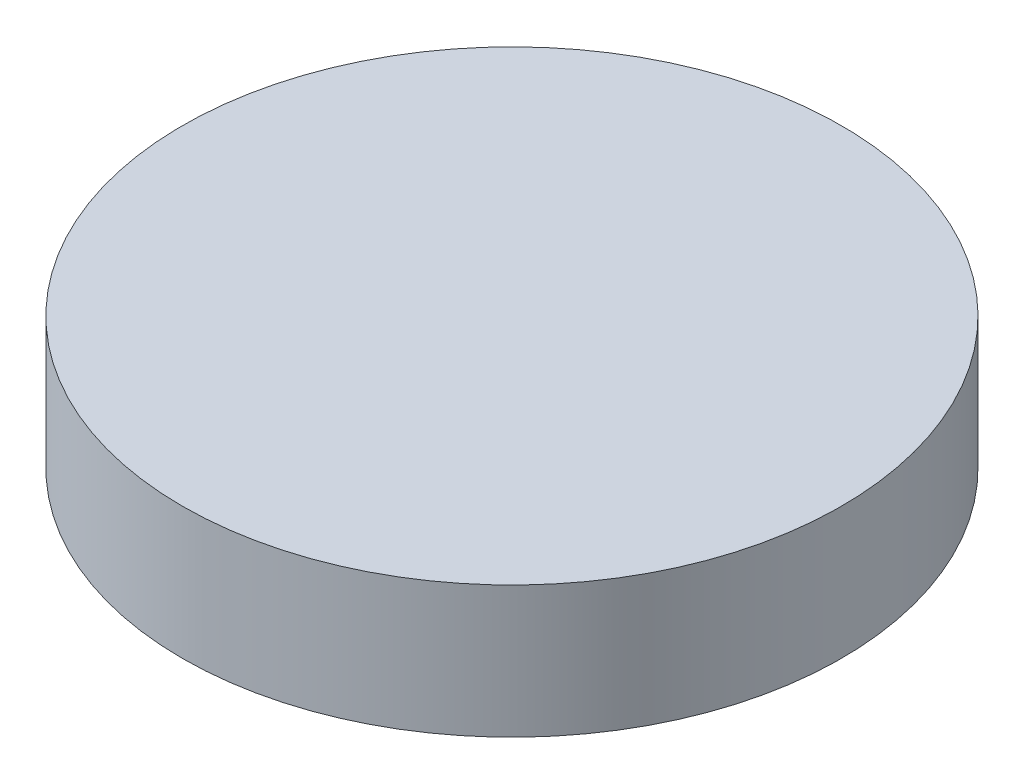
ISO-10303-21;
HEADER;
FILE_DESCRIPTION(('STEP AP214'),'2;1');
FILE_NAME('part.step','',(''),(''),'','','');
FILE_SCHEMA(('AUTOMOTIVE_DESIGN { 1 0 10303 214 1 1 1 1 }'));
ENDSEC;
DATA;
#1=APPLICATION_CONTEXT('core data for automotive mechanical design processes');
#2=APPLICATION_PROTOCOL_DEFINITION('international standard','automotive_design',2000,#1);
#3=PRODUCT_CONTEXT('',#1,'mechanical');
#4=PRODUCT('Part','Part','',(#3));
#5=PRODUCT_RELATED_PRODUCT_CATEGORY('part','',(#4));
#6=PRODUCT_DEFINITION_FORMATION('','',#4);
#7=PRODUCT_DEFINITION_CONTEXT('part definition',#1,'design');
#8=PRODUCT_DEFINITION('design','',#6,#7);
#9=PRODUCT_DEFINITION_SHAPE('','',#8);
#10=(LENGTH_UNIT() NAMED_UNIT(*) SI_UNIT(.MILLI.,.METRE.));
#11=(NAMED_UNIT(*) PLANE_ANGLE_UNIT() SI_UNIT($,.RADIAN.));
#12=(NAMED_UNIT(*) SI_UNIT($,.STERADIAN.) SOLID_ANGLE_UNIT());
#13=UNCERTAINTY_MEASURE_WITH_UNIT(LENGTH_MEASURE(1.E-05),#10,'distance_accuracy_value','');
#14=(GEOMETRIC_REPRESENTATION_CONTEXT(3) GLOBAL_UNCERTAINTY_ASSIGNED_CONTEXT((#13)) GLOBAL_UNIT_ASSIGNED_CONTEXT((#10,
#11,#12)) REPRESENTATION_CONTEXT('',''));
#15=CARTESIAN_POINT('',(0.,0.,0.));
#16=DIRECTION('',(0.,0.,1.));
#17=DIRECTION('',(1.,0.,0.));
#18=AXIS2_PLACEMENT_3D('',#15,#16,#17);
#19=CARTESIAN_POINT('',(0.,10.16,0.));
#20=DIRECTION('',(0.,-1.,0.));
#21=DIRECTION('',(0.,0.,-1.));
#22=AXIS2_PLACEMENT_3D('',#19,#20,#21);
#23=CYLINDRICAL_SURFACE('',#22,25.4);
#24=CARTESIAN_POINT('',(0.,10.16,0.));
#25=DIRECTION('',(0.,1.,0.));
#26=DIRECTION('',(0.,0.,1.));
#27=AXIS2_PLACEMENT_3D('',#24,#25,#26);
#28=CIRCLE('',#27,25.4);
#29=CARTESIAN_POINT('',(0.,10.16,25.4));
#30=VERTEX_POINT('',#29);
#31=EDGE_CURVE('E10',#30,#30,#28,.T.);
#32=ORIENTED_EDGE('',*,*,#31,.F.);
#33=EDGE_LOOP('',(#32));
#34=FACE_BOUND('',#33,.T.);
#35=CARTESIAN_POINT('',(0.,0.,0.));
#36=DIRECTION('',(0.,1.,0.));
#37=DIRECTION('',(0.,0.,1.));
#38=AXIS2_PLACEMENT_3D('',#35,#36,#37);
#39=CIRCLE('',#38,25.4);
#40=CARTESIAN_POINT('',(0.,0.,25.4));
#41=VERTEX_POINT('',#40);
#42=EDGE_CURVE('E46',#41,#41,#39,.T.);
#43=ORIENTED_EDGE('',*,*,#42,.T.);
#44=EDGE_LOOP('',(#43));
#45=FACE_BOUND('',#44,.T.);
#46=ADVANCED_FACE('F43',(#34,#45),#23,.T.);
#47=CARTESIAN_POINT('',(0.,10.16,0.));
#48=DIRECTION('',(0.,1.,0.));
#49=DIRECTION('',(0.,0.,1.));
#50=AXIS2_PLACEMENT_3D('',#47,#48,#49);
#51=PLANE('',#50);
#52=ORIENTED_EDGE('',*,*,#31,.T.);
#53=EDGE_LOOP('',(#52));
#54=FACE_BOUND('',#53,.T.);
#55=ADVANCED_FACE('F76',(#54),#51,.T.);
#56=CARTESIAN_POINT('',(0.,0.,0.));
#57=DIRECTION('',(0.,1.,0.));
#58=DIRECTION('',(0.,0.,1.));
#59=AXIS2_PLACEMENT_3D('',#56,#57,#58);
#60=PLANE('',#59);
#61=CARTESIAN_POINT('',(0.,0.,0.));
#62=DIRECTION('',(0.,-1.,0.));
#63=DIRECTION('',(0.,0.,-1.));
#64=AXIS2_PLACEMENT_3D('',#61,#62,#63);
#65=CIRCLE('',#64,22.2498118918323);
#66=CARTESIAN_POINT('',(0.,0.,-22.2498118918323));
#67=VERTEX_POINT('',#66);
#68=EDGE_CURVE('E57',#67,#67,#65,.T.);
#69=ORIENTED_EDGE('',*,*,#68,.F.);
#70=EDGE_LOOP('',(#69));
#71=FACE_BOUND('',#70,.T.);
#72=ORIENTED_EDGE('',*,*,#42,.F.);
#73=EDGE_LOOP('',(#72));
#74=FACE_BOUND('',#73,.T.);
#75=ADVANCED_FACE('F70',(#71,#74),#60,.F.);
#76=CARTESIAN_POINT('',(0.,7.62,0.));
#77=DIRECTION('',(0.,-1.,0.));
#78=DIRECTION('',(0.,0.,-1.));
#79=AXIS2_PLACEMENT_3D('',#76,#77,#78);
#80=CYLINDRICAL_SURFACE('',#79,22.2498118918323);
#81=CARTESIAN_POINT('',(0.,7.62,0.));
#82=DIRECTION('',(0.,-1.,0.));
#83=DIRECTION('',(0.,0.,-1.));
#84=AXIS2_PLACEMENT_3D('',#81,#82,#83);
#85=CIRCLE('',#84,22.2498118918323);
#86=CARTESIAN_POINT('',(0.,7.62,-22.2498118918323));
#87=VERTEX_POINT('',#86);
#88=EDGE_CURVE('E55',#87,#87,#85,.T.);
#89=ORIENTED_EDGE('',*,*,#88,.F.);
#90=EDGE_LOOP('',(#89));
#91=FACE_BOUND('',#90,.T.);
#92=ORIENTED_EDGE('',*,*,#68,.T.);
#93=EDGE_LOOP('',(#92));
#94=FACE_BOUND('',#93,.T.);
#95=ADVANCED_FACE('F67',(#91,#94),#80,.F.);
#96=CARTESIAN_POINT('',(0.,7.62,0.));
#97=DIRECTION('',(0.,-1.,0.));
#98=DIRECTION('',(0.,0.,-1.));
#99=AXIS2_PLACEMENT_3D('',#96,#97,#98);
#100=PLANE('',#99);
#101=ORIENTED_EDGE('',*,*,#88,.T.);
#102=EDGE_LOOP('',(#101));
#103=FACE_BOUND('',#102,.T.);
#104=ADVANCED_FACE('F65',(#103),#100,.T.);
#105=CLOSED_SHELL('',(#46,#55,#75,#95,#104));
#106=MANIFOLD_SOLID_BREP('B2',#105);
#107=ADVANCED_BREP_SHAPE_REPRESENTATION('',(#18,#106),#14);
#108=SHAPE_DEFINITION_REPRESENTATION(#9,#107);
ENDSEC;
END-ISO-10303-21;
